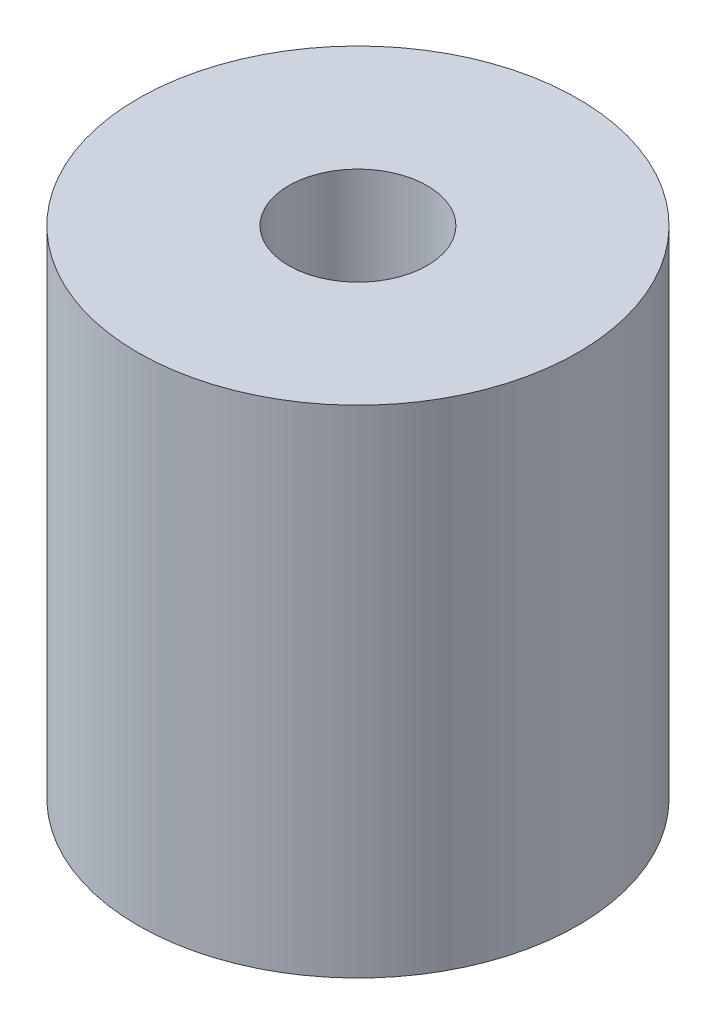
ISO-10303-21;
HEADER;
FILE_DESCRIPTION(('STEP AP214'),'2;1');
FILE_NAME('part.step','',(''),(''),'','','');
FILE_SCHEMA(('AUTOMOTIVE_DESIGN { 1 0 10303 214 1 1 1 1 }'));
ENDSEC;
DATA;
#1=APPLICATION_CONTEXT('core data for automotive mechanical design processes');
#2=APPLICATION_PROTOCOL_DEFINITION('international standard','automotive_design',2000,#1);
#3=PRODUCT_CONTEXT('',#1,'mechanical');
#4=PRODUCT('Part','Part','',(#3));
#5=PRODUCT_RELATED_PRODUCT_CATEGORY('part','',(#4));
#6=PRODUCT_DEFINITION_FORMATION('','',#4);
#7=PRODUCT_DEFINITION_CONTEXT('part definition',#1,'design');
#8=PRODUCT_DEFINITION('design','',#6,#7);
#9=PRODUCT_DEFINITION_SHAPE('','',#8);
#10=(LENGTH_UNIT() NAMED_UNIT(*) SI_UNIT(.MILLI.,.METRE.));
#11=(NAMED_UNIT(*) PLANE_ANGLE_UNIT() SI_UNIT($,.RADIAN.));
#12=(NAMED_UNIT(*) SI_UNIT($,.STERADIAN.) SOLID_ANGLE_UNIT());
#13=UNCERTAINTY_MEASURE_WITH_UNIT(LENGTH_MEASURE(1.E-05),#10,'distance_accuracy_value','');
#14=(GEOMETRIC_REPRESENTATION_CONTEXT(3) GLOBAL_UNCERTAINTY_ASSIGNED_CONTEXT((#13)) GLOBAL_UNIT_ASSIGNED_CONTEXT((#10,
#11,#12)) REPRESENTATION_CONTEXT('',''));
#15=CARTESIAN_POINT('',(0.,0.,0.));
#16=DIRECTION('',(0.,0.,1.));
#17=DIRECTION('',(1.,0.,0.));
#18=AXIS2_PLACEMENT_3D('',#15,#16,#17);
#19=CARTESIAN_POINT('',(0.,11.275,0.));
#20=DIRECTION('',(0.,1.,0.));
#21=DIRECTION('',(0.,0.,1.));
#22=AXIS2_PLACEMENT_3D('',#19,#20,#21);
#23=PLANE('',#22);
#24=CARTESIAN_POINT('',(0.,11.275,0.));
#25=DIRECTION('',(0.,1.,0.));
#26=DIRECTION('',(0.,0.,1.));
#27=AXIS2_PLACEMENT_3D('',#24,#25,#26);
#28=CIRCLE('',#27,5.);
#29=CARTESIAN_POINT('',(0.,11.275,5.));
#30=VERTEX_POINT('',#29);
#31=EDGE_CURVE('E10',#30,#30,#28,.T.);
#32=ORIENTED_EDGE('',*,*,#31,.T.);
#33=EDGE_LOOP('',(#32));
#34=FACE_BOUND('',#33,.T.);
#35=CARTESIAN_POINT('',(0.,11.275,0.));
#36=DIRECTION('',(0.,1.,0.));
#37=DIRECTION('',(0.,0.,1.));
#38=AXIS2_PLACEMENT_3D('',#35,#36,#37);
#39=CIRCLE('',#38,1.575);
#40=CARTESIAN_POINT('',(0.,11.275,1.575));
#41=VERTEX_POINT('',#40);
#42=EDGE_CURVE('E56',#41,#41,#39,.T.);
#43=ORIENTED_EDGE('',*,*,#42,.F.);
#44=EDGE_LOOP('',(#43));
#45=FACE_BOUND('',#44,.T.);
#46=ADVANCED_FACE('F43',(#34,#45),#23,.T.);
#47=CARTESIAN_POINT('',(0.,0.,0.));
#48=DIRECTION('',(0.,1.,0.));
#49=DIRECTION('',(0.,0.,1.));
#50=AXIS2_PLACEMENT_3D('',#47,#48,#49);
#51=PLANE('',#50);
#52=CARTESIAN_POINT('',(0.,0.,0.));
#53=DIRECTION('',(0.,1.,0.));
#54=DIRECTION('',(0.,0.,1.));
#55=AXIS2_PLACEMENT_3D('',#52,#53,#54);
#56=CIRCLE('',#55,5.);
#57=CARTESIAN_POINT('',(0.,0.,5.));
#58=VERTEX_POINT('',#57);
#59=EDGE_CURVE('E47',#58,#58,#56,.T.);
#60=ORIENTED_EDGE('',*,*,#59,.F.);
#61=EDGE_LOOP('',(#60));
#62=FACE_BOUND('',#61,.T.);
#63=CARTESIAN_POINT('',(0.,0.,0.));
#64=DIRECTION('',(0.,1.,0.));
#65=DIRECTION('',(0.,0.,1.));
#66=AXIS2_PLACEMENT_3D('',#63,#64,#65);
#67=CIRCLE('',#66,1.575);
#68=CARTESIAN_POINT('',(0.,0.,1.575));
#69=VERTEX_POINT('',#68);
#70=EDGE_CURVE('E58',#69,#69,#67,.T.);
#71=ORIENTED_EDGE('',*,*,#70,.T.);
#72=EDGE_LOOP('',(#71));
#73=FACE_BOUND('',#72,.T.);
#74=ADVANCED_FACE('F70',(#62,#73),#51,.F.);
#75=CARTESIAN_POINT('',(0.,11.275,0.));
#76=DIRECTION('',(0.,-1.,0.));
#77=DIRECTION('',(0.,0.,-1.));
#78=AXIS2_PLACEMENT_3D('',#75,#76,#77);
#79=CYLINDRICAL_SURFACE('',#78,5.);
#80=ORIENTED_EDGE('',*,*,#31,.F.);
#81=EDGE_LOOP('',(#80));
#82=FACE_BOUND('',#81,.T.);
#83=ORIENTED_EDGE('',*,*,#59,.T.);
#84=EDGE_LOOP('',(#83));
#85=FACE_BOUND('',#84,.T.);
#86=ADVANCED_FACE('F45',(#82,#85),#79,.T.);
#87=CARTESIAN_POINT('',(0.,11.275,0.));
#88=DIRECTION('',(0.,-1.,0.));
#89=DIRECTION('',(0.,0.,-1.));
#90=AXIS2_PLACEMENT_3D('',#87,#88,#89);
#91=CYLINDRICAL_SURFACE('',#90,1.575);
#92=ORIENTED_EDGE('',*,*,#42,.T.);
#93=EDGE_LOOP('',(#92));
#94=FACE_BOUND('',#93,.T.);
#95=ORIENTED_EDGE('',*,*,#70,.F.);
#96=EDGE_LOOP('',(#95));
#97=FACE_BOUND('',#96,.T.);
#98=ADVANCED_FACE('F66',(#94,#97),#91,.F.);
#99=CLOSED_SHELL('',(#46,#74,#86,#98));
#100=MANIFOLD_SOLID_BREP('B2',#99);
#101=ADVANCED_BREP_SHAPE_REPRESENTATION('',(#18,#100),#14);
#102=SHAPE_DEFINITION_REPRESENTATION(#9,#101);
ENDSEC;
END-ISO-10303-21;
